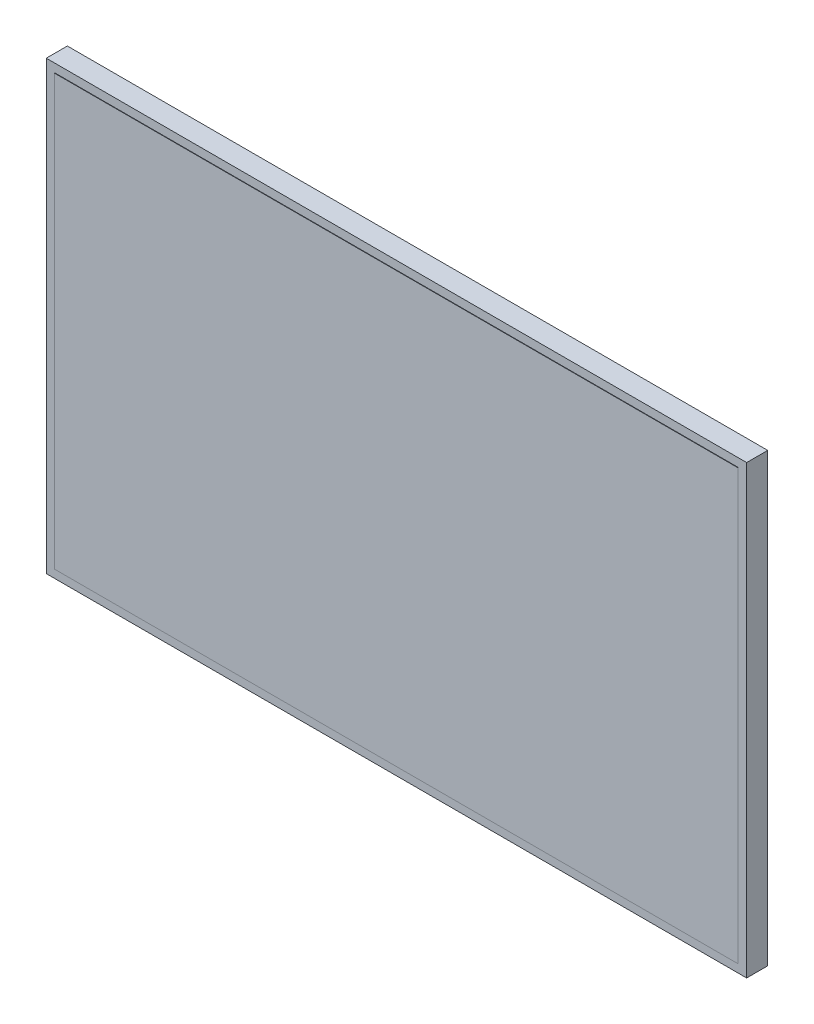
ISO-10303-21;
HEADER;
FILE_DESCRIPTION(('STEP AP214'),'2;1');
FILE_NAME('part.step','',(''),(''),'','','');
FILE_SCHEMA(('AUTOMOTIVE_DESIGN { 1 0 10303 214 1 1 1 1 }'));
ENDSEC;
DATA;
#1=APPLICATION_CONTEXT('core data for automotive mechanical design processes');
#2=APPLICATION_PROTOCOL_DEFINITION('international standard','automotive_design',2000,#1);
#3=PRODUCT_CONTEXT('',#1,'mechanical');
#4=PRODUCT('Part','Part','',(#3));
#5=PRODUCT_RELATED_PRODUCT_CATEGORY('part','',(#4));
#6=PRODUCT_DEFINITION_FORMATION('','',#4);
#7=PRODUCT_DEFINITION_CONTEXT('part definition',#1,'design');
#8=PRODUCT_DEFINITION('design','',#6,#7);
#9=PRODUCT_DEFINITION_SHAPE('','',#8);
#10=(LENGTH_UNIT() NAMED_UNIT(*) SI_UNIT(.MILLI.,.METRE.));
#11=(NAMED_UNIT(*) PLANE_ANGLE_UNIT() SI_UNIT($,.RADIAN.));
#12=(NAMED_UNIT(*) SI_UNIT($,.STERADIAN.) SOLID_ANGLE_UNIT());
#13=UNCERTAINTY_MEASURE_WITH_UNIT(LENGTH_MEASURE(1.E-05),#10,'distance_accuracy_value','');
#14=(GEOMETRIC_REPRESENTATION_CONTEXT(3) GLOBAL_UNCERTAINTY_ASSIGNED_CONTEXT((#13)) GLOBAL_UNIT_ASSIGNED_CONTEXT((#10,
#11,#12)) REPRESENTATION_CONTEXT('',''));
#15=CARTESIAN_POINT('',(0.,0.,0.));
#16=DIRECTION('',(0.,0.,1.));
#17=DIRECTION('',(1.,0.,0.));
#18=AXIS2_PLACEMENT_3D('',#15,#16,#17);
#19=CARTESIAN_POINT('',(0.,0.,2.5));
#20=DIRECTION('',(0.,0.,-1.));
#21=DIRECTION('',(-1.,0.,0.));
#22=AXIS2_PLACEMENT_3D('',#19,#20,#21);
#23=PLANE('',#22);
#24=DIRECTION('',(0.,1.,0.));
#25=VECTOR('',#24,1.);
#26=CARTESIAN_POINT('',(83.,-52.9,2.5));
#27=LINE('',#26,#25);
#28=CARTESIAN_POINT('',(83.,-52.9,2.5));
#29=VERTEX_POINT('',#28);
#30=CARTESIAN_POINT('',(83.,52.9,2.5));
#31=VERTEX_POINT('',#30);
#32=EDGE_CURVE('E129',#29,#31,#27,.T.);
#33=ORIENTED_EDGE('',*,*,#32,.T.);
#34=DIRECTION('',(-1.,0.,0.));
#35=VECTOR('',#34,1.);
#36=CARTESIAN_POINT('',(-83.,52.9,2.5));
#37=LINE('',#36,#35);
#38=CARTESIAN_POINT('',(-83.,52.9,2.5));
#39=VERTEX_POINT('',#38);
#40=EDGE_CURVE('E132',#31,#39,#37,.T.);
#41=ORIENTED_EDGE('',*,*,#40,.T.);
#42=DIRECTION('',(0.,-1.,0.));
#43=VECTOR('',#42,1.);
#44=CARTESIAN_POINT('',(-83.,-52.9,2.5));
#45=LINE('',#44,#43);
#46=CARTESIAN_POINT('',(-83.,-52.9,2.5));
#47=VERTEX_POINT('',#46);
#48=EDGE_CURVE('E135',#39,#47,#45,.T.);
#49=ORIENTED_EDGE('',*,*,#48,.T.);
#50=DIRECTION('',(1.,0.,0.));
#51=VECTOR('',#50,1.);
#52=CARTESIAN_POINT('',(-83.,-52.9,2.5));
#53=LINE('',#52,#51);
#54=EDGE_CURVE('E137',#47,#29,#53,.T.);
#55=ORIENTED_EDGE('',*,*,#54,.T.);
#56=EDGE_LOOP('',(#33,#41,#49,#55));
#57=FACE_BOUND('',#56,.T.);
#58=DIRECTION('',(0.,1.,0.));
#59=VECTOR('',#58,1.);
#60=CARTESIAN_POINT('',(81.,-50.9,2.5));
#61=LINE('',#60,#59);
#62=CARTESIAN_POINT('',(81.,-50.9,2.5));
#63=VERTEX_POINT('',#62);
#64=CARTESIAN_POINT('',(81.,50.9,2.5));
#65=VERTEX_POINT('',#64);
#66=EDGE_CURVE('E50',#63,#65,#61,.T.);
#67=ORIENTED_EDGE('',*,*,#66,.F.);
#68=DIRECTION('',(1.,0.,0.));
#69=VECTOR('',#68,1.);
#70=CARTESIAN_POINT('',(-81.,-50.9,2.5));
#71=LINE('',#70,#69);
#72=CARTESIAN_POINT('',(-81.,-50.9,2.5));
#73=VERTEX_POINT('',#72);
#74=EDGE_CURVE('E54',#73,#63,#71,.T.);
#75=ORIENTED_EDGE('',*,*,#74,.F.);
#76=DIRECTION('',(0.,-1.,0.));
#77=VECTOR('',#76,1.);
#78=CARTESIAN_POINT('',(-81.,-50.9,2.5));
#79=LINE('',#78,#77);
#80=CARTESIAN_POINT('',(-81.,50.9,2.5));
#81=VERTEX_POINT('',#80);
#82=EDGE_CURVE('E266',#81,#73,#79,.T.);
#83=ORIENTED_EDGE('',*,*,#82,.F.);
#84=DIRECTION('',(-1.,0.,0.));
#85=VECTOR('',#84,1.);
#86=CARTESIAN_POINT('',(-81.,50.9,2.5));
#87=LINE('',#86,#85);
#88=EDGE_CURVE('E272',#65,#81,#87,.T.);
#89=ORIENTED_EDGE('',*,*,#88,.F.);
#90=EDGE_LOOP('',(#67,#75,#83,#89));
#91=FACE_BOUND('',#90,.T.);
#92=ADVANCED_FACE('F35',(#57,#91),#23,.F.);
#93=CARTESIAN_POINT('',(83.,-52.9,2.5));
#94=DIRECTION('',(-1.,0.,0.));
#95=DIRECTION('',(0.,0.,1.));
#96=AXIS2_PLACEMENT_3D('',#93,#94,#95);
#97=PLANE('',#96);
#98=DIRECTION('',(0.,1.,0.));
#99=VECTOR('',#98,1.);
#100=CARTESIAN_POINT('',(83.,-52.9,-2.5));
#101=LINE('',#100,#99);
#102=CARTESIAN_POINT('',(83.,-52.9,-2.5));
#103=VERTEX_POINT('',#102);
#104=CARTESIAN_POINT('',(83.,52.9,-2.5));
#105=VERTEX_POINT('',#104);
#106=EDGE_CURVE('E120',#103,#105,#101,.T.);
#107=ORIENTED_EDGE('',*,*,#106,.T.);
#108=DIRECTION('',(0.,0.,-1.));
#109=VECTOR('',#108,1.);
#110=CARTESIAN_POINT('',(83.,52.9,2.5));
#111=LINE('',#110,#109);
#112=EDGE_CURVE('E11',#31,#105,#111,.T.);
#113=ORIENTED_EDGE('',*,*,#112,.F.);
#114=ORIENTED_EDGE('',*,*,#32,.F.);
#115=DIRECTION('',(0.,0.,-1.));
#116=VECTOR('',#115,1.);
#117=CARTESIAN_POINT('',(83.,-52.9,2.5));
#118=LINE('',#117,#116);
#119=EDGE_CURVE('E138',#29,#103,#118,.T.);
#120=ORIENTED_EDGE('',*,*,#119,.T.);
#121=EDGE_LOOP('',(#107,#113,#114,#120));
#122=FACE_BOUND('',#121,.T.);
#123=ADVANCED_FACE('F37',(#122),#97,.F.);
#124=CARTESIAN_POINT('',(-83.,52.9,2.5));
#125=DIRECTION('',(0.,-1.,0.));
#126=DIRECTION('',(0.,0.,-1.));
#127=AXIS2_PLACEMENT_3D('',#124,#125,#126);
#128=PLANE('',#127);
#129=DIRECTION('',(-1.,0.,0.));
#130=VECTOR('',#129,1.);
#131=CARTESIAN_POINT('',(-83.,52.9,-2.5));
#132=LINE('',#131,#130);
#133=CARTESIAN_POINT('',(-83.,52.9,-2.5));
#134=VERTEX_POINT('',#133);
#135=EDGE_CURVE('E123',#105,#134,#132,.T.);
#136=ORIENTED_EDGE('',*,*,#135,.T.);
#137=DIRECTION('',(0.,0.,-1.));
#138=VECTOR('',#137,1.);
#139=CARTESIAN_POINT('',(-83.,52.9,2.5));
#140=LINE('',#139,#138);
#141=EDGE_CURVE('E43',#39,#134,#140,.T.);
#142=ORIENTED_EDGE('',*,*,#141,.F.);
#143=ORIENTED_EDGE('',*,*,#40,.F.);
#144=ORIENTED_EDGE('',*,*,#112,.T.);
#145=EDGE_LOOP('',(#136,#142,#143,#144));
#146=FACE_BOUND('',#145,.T.);
#147=ADVANCED_FACE('F168',(#146),#128,.F.);
#148=CARTESIAN_POINT('',(-83.,-52.9,2.5));
#149=DIRECTION('',(1.,0.,0.));
#150=DIRECTION('',(0.,0.,-1.));
#151=AXIS2_PLACEMENT_3D('',#148,#149,#150);
#152=PLANE('',#151);
#153=DIRECTION('',(0.,-1.,0.));
#154=VECTOR('',#153,1.);
#155=CARTESIAN_POINT('',(-83.,-52.9,-2.5));
#156=LINE('',#155,#154);
#157=CARTESIAN_POINT('',(-83.,-52.9,-2.5));
#158=VERTEX_POINT('',#157);
#159=EDGE_CURVE('E141',#134,#158,#156,.T.);
#160=ORIENTED_EDGE('',*,*,#159,.T.);
#161=DIRECTION('',(0.,0.,-1.));
#162=VECTOR('',#161,1.);
#163=CARTESIAN_POINT('',(-83.,-52.9,2.5));
#164=LINE('',#163,#162);
#165=EDGE_CURVE('E146',#47,#158,#164,.T.);
#166=ORIENTED_EDGE('',*,*,#165,.F.);
#167=ORIENTED_EDGE('',*,*,#48,.F.);
#168=ORIENTED_EDGE('',*,*,#141,.T.);
#169=EDGE_LOOP('',(#160,#166,#167,#168));
#170=FACE_BOUND('',#169,.T.);
#171=ADVANCED_FACE('F153',(#170),#152,.F.);
#172=CARTESIAN_POINT('',(-83.,-52.9,2.5));
#173=DIRECTION('',(0.,1.,0.));
#174=DIRECTION('',(0.,0.,1.));
#175=AXIS2_PLACEMENT_3D('',#172,#173,#174);
#176=PLANE('',#175);
#177=DIRECTION('',(1.,0.,0.));
#178=VECTOR('',#177,1.);
#179=CARTESIAN_POINT('',(-83.,-52.9,-2.5));
#180=LINE('',#179,#178);
#181=EDGE_CURVE('E133',#158,#103,#180,.T.);
#182=ORIENTED_EDGE('',*,*,#181,.T.);
#183=ORIENTED_EDGE('',*,*,#119,.F.);
#184=ORIENTED_EDGE('',*,*,#54,.F.);
#185=ORIENTED_EDGE('',*,*,#165,.T.);
#186=EDGE_LOOP('',(#182,#183,#184,#185));
#187=FACE_BOUND('',#186,.T.);
#188=ADVANCED_FACE('F162',(#187),#176,.F.);
#189=CARTESIAN_POINT('',(0.,0.,-2.5));
#190=DIRECTION('',(0.,0.,-1.));
#191=DIRECTION('',(-1.,0.,0.));
#192=AXIS2_PLACEMENT_3D('',#189,#190,#191);
#193=PLANE('',#192);
#194=ORIENTED_EDGE('',*,*,#106,.F.);
#195=ORIENTED_EDGE('',*,*,#181,.F.);
#196=ORIENTED_EDGE('',*,*,#159,.F.);
#197=ORIENTED_EDGE('',*,*,#135,.F.);
#198=EDGE_LOOP('',(#194,#195,#196,#197));
#199=FACE_BOUND('',#198,.T.);
#200=ADVANCED_FACE('F159',(#199),#193,.T.);
#201=CARTESIAN_POINT('',(81.,-50.9,2.6));
#202=DIRECTION('',(-1.,0.,0.));
#203=DIRECTION('',(0.,0.,1.));
#204=AXIS2_PLACEMENT_3D('',#201,#202,#203);
#205=PLANE('',#204);
#206=ORIENTED_EDGE('',*,*,#66,.T.);
#207=DIRECTION('',(0.,0.,-1.));
#208=VECTOR('',#207,1.);
#209=CARTESIAN_POINT('',(81.,50.9,2.6));
#210=LINE('',#209,#208);
#211=CARTESIAN_POINT('',(81.,50.9,2.6));
#212=VERTEX_POINT('',#211);
#213=EDGE_CURVE('E103',#212,#65,#210,.T.);
#214=ORIENTED_EDGE('',*,*,#213,.F.);
#215=DIRECTION('',(0.,1.,0.));
#216=VECTOR('',#215,1.);
#217=CARTESIAN_POINT('',(81.,-50.9,2.6));
#218=LINE('',#217,#216);
#219=CARTESIAN_POINT('',(81.,-50.9,2.6));
#220=VERTEX_POINT('',#219);
#221=EDGE_CURVE('E109',#220,#212,#218,.T.);
#222=ORIENTED_EDGE('',*,*,#221,.F.);
#223=DIRECTION('',(0.,0.,-1.));
#224=VECTOR('',#223,1.);
#225=CARTESIAN_POINT('',(81.,-50.9,2.6));
#226=LINE('',#225,#224);
#227=EDGE_CURVE('E264',#220,#63,#226,.T.);
#228=ORIENTED_EDGE('',*,*,#227,.T.);
#229=EDGE_LOOP('',(#206,#214,#222,#228));
#230=FACE_BOUND('',#229,.T.);
#231=ADVANCED_FACE('F119',(#230),#205,.F.);
#232=CARTESIAN_POINT('',(-81.,50.9,2.6));
#233=DIRECTION('',(0.,-1.,0.));
#234=DIRECTION('',(0.,0.,-1.));
#235=AXIS2_PLACEMENT_3D('',#232,#233,#234);
#236=PLANE('',#235);
#237=ORIENTED_EDGE('',*,*,#88,.T.);
#238=DIRECTION('',(0.,0.,-1.));
#239=VECTOR('',#238,1.);
#240=CARTESIAN_POINT('',(-81.,50.9,2.6));
#241=LINE('',#240,#239);
#242=CARTESIAN_POINT('',(-81.,50.9,2.6));
#243=VERTEX_POINT('',#242);
#244=EDGE_CURVE('E105',#243,#81,#241,.T.);
#245=ORIENTED_EDGE('',*,*,#244,.F.);
#246=DIRECTION('',(-1.,0.,0.));
#247=VECTOR('',#246,1.);
#248=CARTESIAN_POINT('',(-81.,50.9,2.6));
#249=LINE('',#248,#247);
#250=EDGE_CURVE('E98',#212,#243,#249,.T.);
#251=ORIENTED_EDGE('',*,*,#250,.F.);
#252=ORIENTED_EDGE('',*,*,#213,.T.);
#253=EDGE_LOOP('',(#237,#245,#251,#252));
#254=FACE_BOUND('',#253,.T.);
#255=ADVANCED_FACE('F101',(#254),#236,.F.);
#256=CARTESIAN_POINT('',(-81.,-50.9,2.6));
#257=DIRECTION('',(1.,0.,0.));
#258=DIRECTION('',(0.,0.,-1.));
#259=AXIS2_PLACEMENT_3D('',#256,#257,#258);
#260=PLANE('',#259);
#261=ORIENTED_EDGE('',*,*,#82,.T.);
#262=DIRECTION('',(0.,0.,-1.));
#263=VECTOR('',#262,1.);
#264=CARTESIAN_POINT('',(-81.,-50.9,2.6));
#265=LINE('',#264,#263);
#266=CARTESIAN_POINT('',(-81.,-50.9,2.6));
#267=VERTEX_POINT('',#266);
#268=EDGE_CURVE('E125',#267,#73,#265,.T.);
#269=ORIENTED_EDGE('',*,*,#268,.F.);
#270=DIRECTION('',(0.,-1.,0.));
#271=VECTOR('',#270,1.);
#272=CARTESIAN_POINT('',(-81.,-50.9,2.6));
#273=LINE('',#272,#271);
#274=EDGE_CURVE('E108',#243,#267,#273,.T.);
#275=ORIENTED_EDGE('',*,*,#274,.F.);
#276=ORIENTED_EDGE('',*,*,#244,.T.);
#277=EDGE_LOOP('',(#261,#269,#275,#276));
#278=FACE_BOUND('',#277,.T.);
#279=ADVANCED_FACE('F205',(#278),#260,.F.);
#280=CARTESIAN_POINT('',(-81.,-50.9,2.6));
#281=DIRECTION('',(0.,1.,0.));
#282=DIRECTION('',(0.,0.,1.));
#283=AXIS2_PLACEMENT_3D('',#280,#281,#282);
#284=PLANE('',#283);
#285=ORIENTED_EDGE('',*,*,#74,.T.);
#286=ORIENTED_EDGE('',*,*,#227,.F.);
#287=DIRECTION('',(1.,0.,0.));
#288=VECTOR('',#287,1.);
#289=CARTESIAN_POINT('',(-81.,-50.9,2.6));
#290=LINE('',#289,#288);
#291=EDGE_CURVE('E114',#267,#220,#290,.T.);
#292=ORIENTED_EDGE('',*,*,#291,.F.);
#293=ORIENTED_EDGE('',*,*,#268,.T.);
#294=EDGE_LOOP('',(#285,#286,#292,#293));
#295=FACE_BOUND('',#294,.T.);
#296=ADVANCED_FACE('F211',(#295),#284,.F.);
#297=CARTESIAN_POINT('',(0.,0.,2.6));
#298=DIRECTION('',(0.,0.,-1.));
#299=DIRECTION('',(-1.,0.,0.));
#300=AXIS2_PLACEMENT_3D('',#297,#298,#299);
#301=PLANE('',#300);
#302=ORIENTED_EDGE('',*,*,#221,.T.);
#303=ORIENTED_EDGE('',*,*,#250,.T.);
#304=ORIENTED_EDGE('',*,*,#274,.T.);
#305=ORIENTED_EDGE('',*,*,#291,.T.);
#306=EDGE_LOOP('',(#302,#303,#304,#305));
#307=FACE_BOUND('',#306,.T.);
#308=ADVANCED_FACE('F112',(#307),#301,.F.);
#309=CLOSED_SHELL('',(#92,#123,#147,#171,#188,#200,#231,#255,#279,#296,#308));
#310=MANIFOLD_SOLID_BREP('B2',#309);
#311=ADVANCED_BREP_SHAPE_REPRESENTATION('',(#18,#310),#14);
#312=SHAPE_DEFINITION_REPRESENTATION(#9,#311);
ENDSEC;
END-ISO-10303-21;
